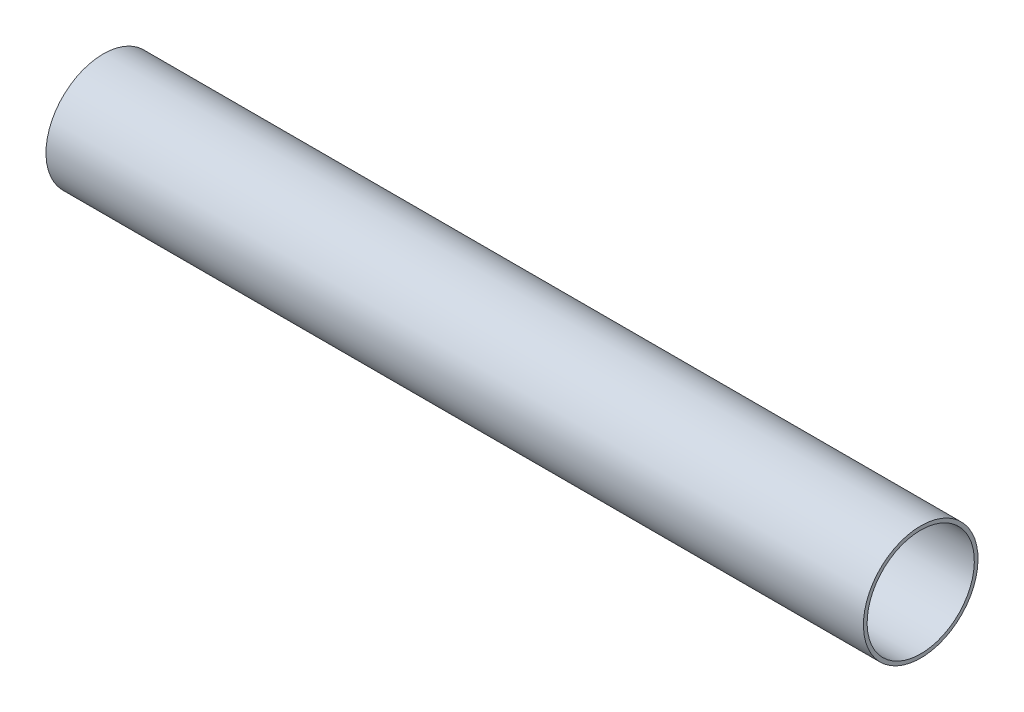
ISO-10303-21;
HEADER;
FILE_DESCRIPTION(('STEP AP214'),'2;1');
FILE_NAME('part.step','',(''),(''),'','','');
FILE_SCHEMA(('AUTOMOTIVE_DESIGN { 1 0 10303 214 1 1 1 1 }'));
ENDSEC;
DATA;
#1=APPLICATION_CONTEXT('core data for automotive mechanical design processes');
#2=APPLICATION_PROTOCOL_DEFINITION('international standard','automotive_design',2000,#1);
#3=PRODUCT_CONTEXT('',#1,'mechanical');
#4=PRODUCT('Part','Part','',(#3));
#5=PRODUCT_RELATED_PRODUCT_CATEGORY('part','',(#4));
#6=PRODUCT_DEFINITION_FORMATION('','',#4);
#7=PRODUCT_DEFINITION_CONTEXT('part definition',#1,'design');
#8=PRODUCT_DEFINITION('design','',#6,#7);
#9=PRODUCT_DEFINITION_SHAPE('','',#8);
#10=(LENGTH_UNIT() NAMED_UNIT(*) SI_UNIT(.MILLI.,.METRE.));
#11=(NAMED_UNIT(*) PLANE_ANGLE_UNIT() SI_UNIT($,.RADIAN.));
#12=(NAMED_UNIT(*) SI_UNIT($,.STERADIAN.) SOLID_ANGLE_UNIT());
#13=UNCERTAINTY_MEASURE_WITH_UNIT(LENGTH_MEASURE(1.E-05),#10,'distance_accuracy_value','');
#14=(GEOMETRIC_REPRESENTATION_CONTEXT(3) GLOBAL_UNCERTAINTY_ASSIGNED_CONTEXT((#13)) GLOBAL_UNIT_ASSIGNED_CONTEXT((#10,
#11,#12)) REPRESENTATION_CONTEXT('',''));
#15=CARTESIAN_POINT('',(0.,0.,0.));
#16=DIRECTION('',(0.,0.,1.));
#17=DIRECTION('',(1.,0.,0.));
#18=AXIS2_PLACEMENT_3D('',#15,#16,#17);
#19=CARTESIAN_POINT('',(-702.056,49.2124999999999,0.));
#20=DIRECTION('',(-1.,0.,0.));
#21=DIRECTION('',(0.,-1.,0.));
#22=AXIS2_PLACEMENT_3D('',#19,#20,#21);
#23=PLANE('',#22);
#24=CARTESIAN_POINT('',(-702.056,0.,0.));
#25=DIRECTION('',(1.,0.,0.));
#26=DIRECTION('',(0.,1.,0.));
#27=AXIS2_PLACEMENT_3D('',#24,#25,#26);
#28=CIRCLE('',#27,46.0375000000001);
#29=CARTESIAN_POINT('',(-702.056,46.0375,0.));
#30=VERTEX_POINT('',#29);
#31=EDGE_CURVE('E10',#30,#30,#28,.T.);
#32=ORIENTED_EDGE('',*,*,#31,.T.);
#33=EDGE_LOOP('',(#32));
#34=FACE_BOUND('',#33,.T.);
#35=CARTESIAN_POINT('',(-702.056,0.,0.));
#36=DIRECTION('',(1.,0.,0.));
#37=DIRECTION('',(0.,1.,0.));
#38=AXIS2_PLACEMENT_3D('',#35,#36,#37);
#39=CIRCLE('',#38,49.2125);
#40=CARTESIAN_POINT('',(-702.056,49.2124999999999,0.));
#41=VERTEX_POINT('',#40);
#42=EDGE_CURVE('E45',#41,#41,#39,.T.);
#43=ORIENTED_EDGE('',*,*,#42,.F.);
#44=EDGE_LOOP('',(#43));
#45=FACE_BOUND('',#44,.T.);
#46=ADVANCED_FACE('F31',(#34,#45),#23,.T.);
#47=CARTESIAN_POINT('',(0.,0.,0.));
#48=DIRECTION('',(1.,0.,0.));
#49=DIRECTION('',(0.,1.,0.));
#50=AXIS2_PLACEMENT_3D('',#47,#48,#49);
#51=CYLINDRICAL_SURFACE('',#50,46.0375);
#52=CARTESIAN_POINT('',(0.,0.,0.));
#53=DIRECTION('',(1.,0.,0.));
#54=DIRECTION('',(0.,1.,0.));
#55=AXIS2_PLACEMENT_3D('',#52,#53,#54);
#56=CIRCLE('',#55,46.0375);
#57=CARTESIAN_POINT('',(0.,46.0375,0.));
#58=VERTEX_POINT('',#57);
#59=EDGE_CURVE('E37',#58,#58,#56,.T.);
#60=ORIENTED_EDGE('',*,*,#59,.T.);
#61=EDGE_LOOP('',(#60));
#62=FACE_BOUND('',#61,.T.);
#63=ORIENTED_EDGE('',*,*,#31,.F.);
#64=EDGE_LOOP('',(#63));
#65=FACE_BOUND('',#64,.T.);
#66=ADVANCED_FACE('F55',(#62,#65),#51,.F.);
#67=CARTESIAN_POINT('',(0.,49.2125,0.));
#68=DIRECTION('',(1.,0.,0.));
#69=DIRECTION('',(0.,1.,0.));
#70=AXIS2_PLACEMENT_3D('',#67,#68,#69);
#71=PLANE('',#70);
#72=CARTESIAN_POINT('',(0.,0.,0.));
#73=DIRECTION('',(1.,0.,0.));
#74=DIRECTION('',(0.,1.,0.));
#75=AXIS2_PLACEMENT_3D('',#72,#73,#74);
#76=CIRCLE('',#75,49.2125);
#77=CARTESIAN_POINT('',(0.,49.2125,0.));
#78=VERTEX_POINT('',#77);
#79=EDGE_CURVE('E41',#78,#78,#76,.T.);
#80=ORIENTED_EDGE('',*,*,#79,.T.);
#81=EDGE_LOOP('',(#80));
#82=FACE_BOUND('',#81,.T.);
#83=ORIENTED_EDGE('',*,*,#59,.F.);
#84=EDGE_LOOP('',(#83));
#85=FACE_BOUND('',#84,.T.);
#86=ADVANCED_FACE('F59',(#82,#85),#71,.T.);
#87=CARTESIAN_POINT('',(0.,0.,0.));
#88=DIRECTION('',(1.,0.,0.));
#89=DIRECTION('',(0.,1.,0.));
#90=AXIS2_PLACEMENT_3D('',#87,#88,#89);
#91=CYLINDRICAL_SURFACE('',#90,49.2125);
#92=ORIENTED_EDGE('',*,*,#42,.T.);
#93=EDGE_LOOP('',(#92));
#94=FACE_BOUND('',#93,.T.);
#95=ORIENTED_EDGE('',*,*,#79,.F.);
#96=EDGE_LOOP('',(#95));
#97=FACE_BOUND('',#96,.T.);
#98=ADVANCED_FACE('F51',(#94,#97),#91,.T.);
#99=CLOSED_SHELL('',(#46,#66,#86,#98));
#100=MANIFOLD_SOLID_BREP('B2',#99);
#101=ADVANCED_BREP_SHAPE_REPRESENTATION('',(#18,#100),#14);
#102=SHAPE_DEFINITION_REPRESENTATION(#9,#101);
ENDSEC;
END-ISO-10303-21;
